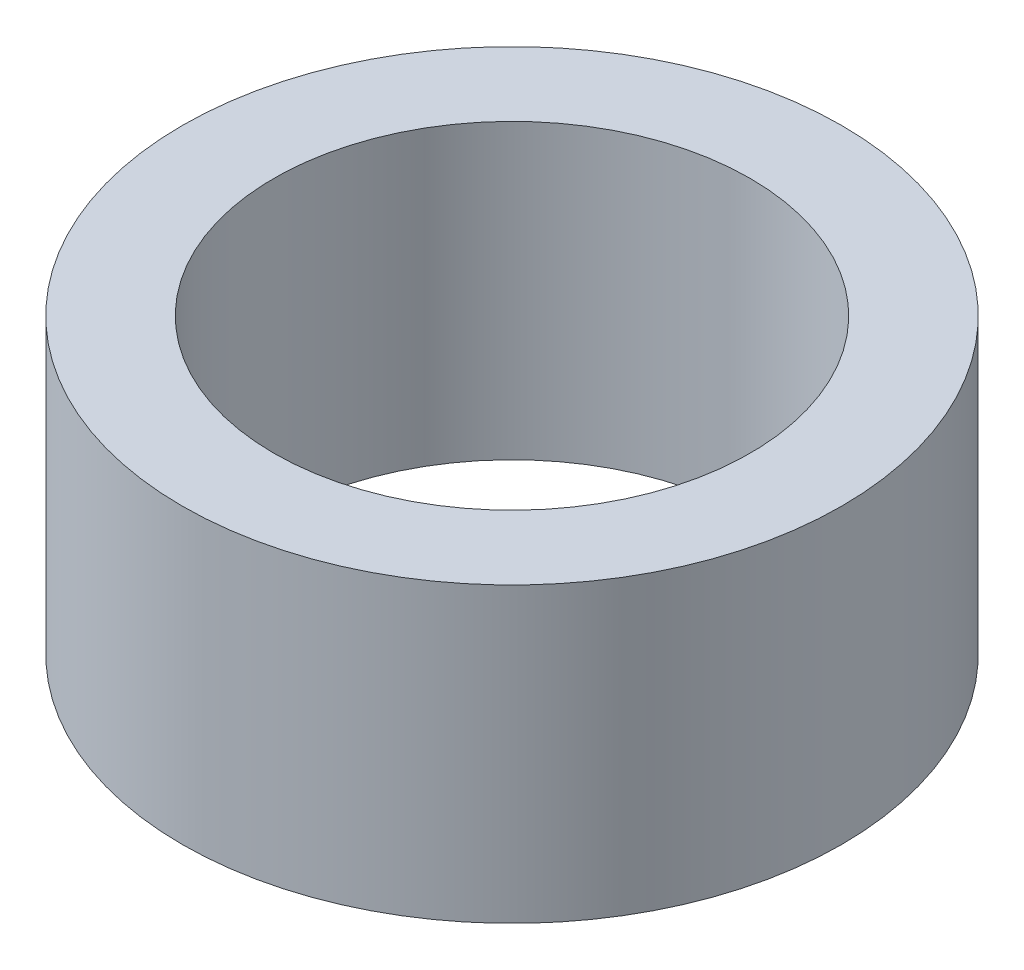
ISO-10303-21;
HEADER;
FILE_DESCRIPTION(('STEP AP214'),'2;1');
FILE_NAME('part.step','',(''),(''),'','','');
FILE_SCHEMA(('AUTOMOTIVE_DESIGN { 1 0 10303 214 1 1 1 1 }'));
ENDSEC;
DATA;
#1=APPLICATION_CONTEXT('core data for automotive mechanical design processes');
#2=APPLICATION_PROTOCOL_DEFINITION('international standard','automotive_design',2000,#1);
#3=PRODUCT_CONTEXT('',#1,'mechanical');
#4=PRODUCT('Part','Part','',(#3));
#5=PRODUCT_RELATED_PRODUCT_CATEGORY('part','',(#4));
#6=PRODUCT_DEFINITION_FORMATION('','',#4);
#7=PRODUCT_DEFINITION_CONTEXT('part definition',#1,'design');
#8=PRODUCT_DEFINITION('design','',#6,#7);
#9=PRODUCT_DEFINITION_SHAPE('','',#8);
#10=(LENGTH_UNIT() NAMED_UNIT(*) SI_UNIT(.MILLI.,.METRE.));
#11=(NAMED_UNIT(*) PLANE_ANGLE_UNIT() SI_UNIT($,.RADIAN.));
#12=(NAMED_UNIT(*) SI_UNIT($,.STERADIAN.) SOLID_ANGLE_UNIT());
#13=UNCERTAINTY_MEASURE_WITH_UNIT(LENGTH_MEASURE(1.E-05),#10,'distance_accuracy_value','');
#14=(GEOMETRIC_REPRESENTATION_CONTEXT(3) GLOBAL_UNCERTAINTY_ASSIGNED_CONTEXT((#13)) GLOBAL_UNIT_ASSIGNED_CONTEXT((#10,
#11,#12)) REPRESENTATION_CONTEXT('',''));
#15=CARTESIAN_POINT('',(0.,0.,0.));
#16=DIRECTION('',(0.,0.,1.));
#17=DIRECTION('',(1.,0.,0.));
#18=AXIS2_PLACEMENT_3D('',#15,#16,#17);
#19=CARTESIAN_POINT('',(0.,8.,0.));
#20=DIRECTION('',(0.,1.,0.));
#21=DIRECTION('',(0.,0.,1.));
#22=AXIS2_PLACEMENT_3D('',#19,#20,#21);
#23=PLANE('',#22);
#24=CARTESIAN_POINT('',(0.,8.,0.));
#25=DIRECTION('',(0.,1.,0.));
#26=DIRECTION('',(0.,0.,1.));
#27=AXIS2_PLACEMENT_3D('',#24,#25,#26);
#28=CIRCLE('',#27,9.);
#29=CARTESIAN_POINT('',(0.,8.,9.));
#30=VERTEX_POINT('',#29);
#31=EDGE_CURVE('E10',#30,#30,#28,.T.);
#32=ORIENTED_EDGE('',*,*,#31,.T.);
#33=EDGE_LOOP('',(#32));
#34=FACE_BOUND('',#33,.T.);
#35=CARTESIAN_POINT('',(0.,8.,0.));
#36=DIRECTION('',(0.,1.,0.));
#37=DIRECTION('',(0.,0.,1.));
#38=AXIS2_PLACEMENT_3D('',#35,#36,#37);
#39=CIRCLE('',#38,6.5);
#40=CARTESIAN_POINT('',(0.,8.,6.5));
#41=VERTEX_POINT('',#40);
#42=EDGE_CURVE('E42',#41,#41,#39,.T.);
#43=ORIENTED_EDGE('',*,*,#42,.F.);
#44=EDGE_LOOP('',(#43));
#45=FACE_BOUND('',#44,.T.);
#46=ADVANCED_FACE('F31',(#34,#45),#23,.T.);
#47=CARTESIAN_POINT('',(0.,0.,0.));
#48=DIRECTION('',(0.,1.,0.));
#49=DIRECTION('',(0.,0.,1.));
#50=AXIS2_PLACEMENT_3D('',#47,#48,#49);
#51=PLANE('',#50);
#52=CARTESIAN_POINT('',(0.,0.,0.));
#53=DIRECTION('',(0.,1.,0.));
#54=DIRECTION('',(0.,0.,1.));
#55=AXIS2_PLACEMENT_3D('',#52,#53,#54);
#56=CIRCLE('',#55,9.);
#57=CARTESIAN_POINT('',(0.,0.,9.));
#58=VERTEX_POINT('',#57);
#59=EDGE_CURVE('E35',#58,#58,#56,.T.);
#60=ORIENTED_EDGE('',*,*,#59,.F.);
#61=EDGE_LOOP('',(#60));
#62=FACE_BOUND('',#61,.T.);
#63=CARTESIAN_POINT('',(0.,0.,0.));
#64=DIRECTION('',(0.,1.,0.));
#65=DIRECTION('',(0.,0.,1.));
#66=AXIS2_PLACEMENT_3D('',#63,#64,#65);
#67=CIRCLE('',#66,6.5);
#68=CARTESIAN_POINT('',(0.,0.,6.5));
#69=VERTEX_POINT('',#68);
#70=EDGE_CURVE('E44',#69,#69,#67,.T.);
#71=ORIENTED_EDGE('',*,*,#70,.T.);
#72=EDGE_LOOP('',(#71));
#73=FACE_BOUND('',#72,.T.);
#74=ADVANCED_FACE('F54',(#62,#73),#51,.F.);
#75=CARTESIAN_POINT('',(0.,8.,0.));
#76=DIRECTION('',(0.,-1.,0.));
#77=DIRECTION('',(0.,0.,-1.));
#78=AXIS2_PLACEMENT_3D('',#75,#76,#77);
#79=CYLINDRICAL_SURFACE('',#78,9.);
#80=ORIENTED_EDGE('',*,*,#31,.F.);
#81=EDGE_LOOP('',(#80));
#82=FACE_BOUND('',#81,.T.);
#83=ORIENTED_EDGE('',*,*,#59,.T.);
#84=EDGE_LOOP('',(#83));
#85=FACE_BOUND('',#84,.T.);
#86=ADVANCED_FACE('F33',(#82,#85),#79,.T.);
#87=CARTESIAN_POINT('',(0.,8.,0.));
#88=DIRECTION('',(0.,-1.,0.));
#89=DIRECTION('',(0.,0.,-1.));
#90=AXIS2_PLACEMENT_3D('',#87,#88,#89);
#91=CYLINDRICAL_SURFACE('',#90,6.5);
#92=ORIENTED_EDGE('',*,*,#42,.T.);
#93=EDGE_LOOP('',(#92));
#94=FACE_BOUND('',#93,.T.);
#95=ORIENTED_EDGE('',*,*,#70,.F.);
#96=EDGE_LOOP('',(#95));
#97=FACE_BOUND('',#96,.T.);
#98=ADVANCED_FACE('F50',(#94,#97),#91,.F.);
#99=CLOSED_SHELL('',(#46,#74,#86,#98));
#100=MANIFOLD_SOLID_BREP('B2',#99);
#101=ADVANCED_BREP_SHAPE_REPRESENTATION('',(#18,#100),#14);
#102=SHAPE_DEFINITION_REPRESENTATION(#9,#101);
ENDSEC;
END-ISO-10303-21;
